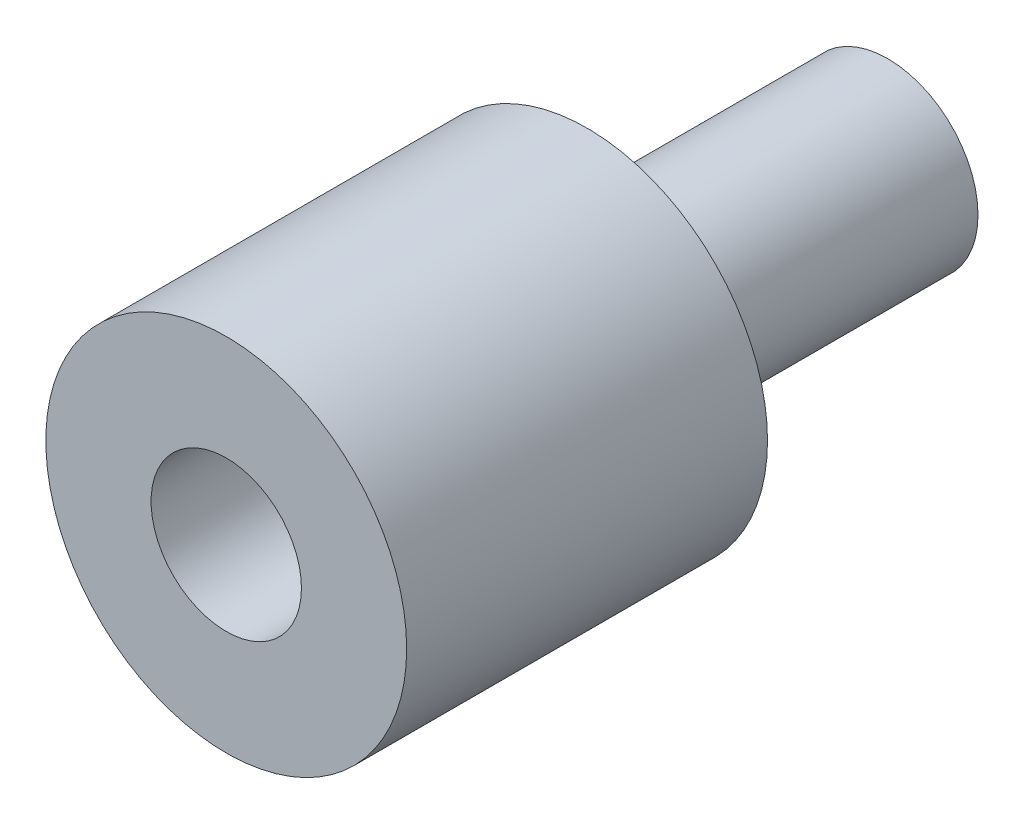
ISO-10303-21;
HEADER;
FILE_DESCRIPTION(('STEP AP214'),'2;1');
FILE_NAME('part.step','',(''),(''),'','','');
FILE_SCHEMA(('AUTOMOTIVE_DESIGN { 1 0 10303 214 1 1 1 1 }'));
ENDSEC;
DATA;
#1=APPLICATION_CONTEXT('core data for automotive mechanical design processes');
#2=APPLICATION_PROTOCOL_DEFINITION('international standard','automotive_design',2000,#1);
#3=PRODUCT_CONTEXT('',#1,'mechanical');
#4=PRODUCT('Part','Part','',(#3));
#5=PRODUCT_RELATED_PRODUCT_CATEGORY('part','',(#4));
#6=PRODUCT_DEFINITION_FORMATION('','',#4);
#7=PRODUCT_DEFINITION_CONTEXT('part definition',#1,'design');
#8=PRODUCT_DEFINITION('design','',#6,#7);
#9=PRODUCT_DEFINITION_SHAPE('','',#8);
#10=(LENGTH_UNIT() NAMED_UNIT(*) SI_UNIT(.MILLI.,.METRE.));
#11=(NAMED_UNIT(*) PLANE_ANGLE_UNIT() SI_UNIT($,.RADIAN.));
#12=(NAMED_UNIT(*) SI_UNIT($,.STERADIAN.) SOLID_ANGLE_UNIT());
#13=UNCERTAINTY_MEASURE_WITH_UNIT(LENGTH_MEASURE(1.E-05),#10,'distance_accuracy_value','');
#14=(GEOMETRIC_REPRESENTATION_CONTEXT(3) GLOBAL_UNCERTAINTY_ASSIGNED_CONTEXT((#13)) GLOBAL_UNIT_ASSIGNED_CONTEXT((#10,
#11,#12)) REPRESENTATION_CONTEXT('',''));
#15=CARTESIAN_POINT('',(0.,0.,0.));
#16=DIRECTION('',(0.,0.,1.));
#17=DIRECTION('',(1.,0.,0.));
#18=AXIS2_PLACEMENT_3D('',#15,#16,#17);
#19=CARTESIAN_POINT('',(0.,0.,24.));
#20=DIRECTION('',(0.,0.,-1.));
#21=DIRECTION('',(-1.,0.,0.));
#22=AXIS2_PLACEMENT_3D('',#19,#20,#21);
#23=CYLINDRICAL_SURFACE('',#22,12.);
#24=CARTESIAN_POINT('',(0.,0.,24.));
#25=DIRECTION('',(0.,0.,1.));
#26=DIRECTION('',(1.,0.,0.));
#27=AXIS2_PLACEMENT_3D('',#24,#25,#26);
#28=CIRCLE('',#27,12.);
#29=CARTESIAN_POINT('',(12.,0.,24.));
#30=VERTEX_POINT('',#29);
#31=EDGE_CURVE('E45',#30,#30,#28,.T.);
#32=ORIENTED_EDGE('',*,*,#31,.F.);
#33=EDGE_LOOP('',(#32));
#34=FACE_BOUND('',#33,.T.);
#35=CARTESIAN_POINT('',(0.,0.,0.));
#36=DIRECTION('',(0.,0.,1.));
#37=DIRECTION('',(1.,0.,0.));
#38=AXIS2_PLACEMENT_3D('',#35,#36,#37);
#39=CIRCLE('',#38,12.);
#40=CARTESIAN_POINT('',(12.,0.,0.));
#41=VERTEX_POINT('',#40);
#42=EDGE_CURVE('E40',#41,#41,#39,.T.);
#43=ORIENTED_EDGE('',*,*,#42,.T.);
#44=EDGE_LOOP('',(#43));
#45=FACE_BOUND('',#44,.T.);
#46=ADVANCED_FACE('F37',(#34,#45),#23,.T.);
#47=CARTESIAN_POINT('',(0.,0.,24.));
#48=DIRECTION('',(0.,0.,1.));
#49=DIRECTION('',(1.,0.,0.));
#50=AXIS2_PLACEMENT_3D('',#47,#48,#49);
#51=PLANE('',#50);
#52=CARTESIAN_POINT('',(0.,0.,24.));
#53=DIRECTION('',(0.,0.,1.));
#54=DIRECTION('',(1.,0.,0.));
#55=AXIS2_PLACEMENT_3D('',#52,#53,#54);
#56=CIRCLE('',#55,5.);
#57=CARTESIAN_POINT('',(5.,0.,24.));
#58=VERTEX_POINT('',#57);
#59=EDGE_CURVE('E58',#58,#58,#56,.T.);
#60=ORIENTED_EDGE('',*,*,#59,.F.);
#61=EDGE_LOOP('',(#60));
#62=FACE_BOUND('',#61,.T.);
#63=ORIENTED_EDGE('',*,*,#31,.T.);
#64=EDGE_LOOP('',(#63));
#65=FACE_BOUND('',#64,.T.);
#66=ADVANCED_FACE('F82',(#62,#65),#51,.T.);
#67=CARTESIAN_POINT('',(0.,0.,0.));
#68=DIRECTION('',(0.,0.,1.));
#69=DIRECTION('',(1.,0.,0.));
#70=AXIS2_PLACEMENT_3D('',#67,#68,#69);
#71=PLANE('',#70);
#72=CARTESIAN_POINT('',(0.,0.,0.));
#73=DIRECTION('',(0.,0.,-1.));
#74=DIRECTION('',(-1.,0.,0.));
#75=AXIS2_PLACEMENT_3D('',#72,#73,#74);
#76=CIRCLE('',#75,6.);
#77=CARTESIAN_POINT('',(-6.,0.,0.));
#78=VERTEX_POINT('',#77);
#79=EDGE_CURVE('E10',#78,#78,#76,.T.);
#80=ORIENTED_EDGE('',*,*,#79,.F.);
#81=EDGE_LOOP('',(#80));
#82=FACE_BOUND('',#81,.T.);
#83=ORIENTED_EDGE('',*,*,#42,.F.);
#84=EDGE_LOOP('',(#83));
#85=FACE_BOUND('',#84,.T.);
#86=ADVANCED_FACE('F87',(#82,#85),#71,.F.);
#87=CARTESIAN_POINT('',(0.,0.,12.));
#88=DIRECTION('',(0.,0.,1.));
#89=DIRECTION('',(1.,0.,0.));
#90=AXIS2_PLACEMENT_3D('',#87,#88,#89);
#91=CYLINDRICAL_SURFACE('',#90,5.);
#92=CARTESIAN_POINT('',(0.,0.,12.));
#93=DIRECTION('',(0.,0.,1.));
#94=DIRECTION('',(1.,0.,0.));
#95=AXIS2_PLACEMENT_3D('',#92,#93,#94);
#96=CIRCLE('',#95,5.);
#97=CARTESIAN_POINT('',(5.,0.,12.));
#98=VERTEX_POINT('',#97);
#99=EDGE_CURVE('E54',#98,#98,#96,.T.);
#100=ORIENTED_EDGE('',*,*,#99,.F.);
#101=EDGE_LOOP('',(#100));
#102=FACE_BOUND('',#101,.T.);
#103=ORIENTED_EDGE('',*,*,#59,.T.);
#104=EDGE_LOOP('',(#103));
#105=FACE_BOUND('',#104,.T.);
#106=ADVANCED_FACE('F78',(#102,#105),#91,.F.);
#107=CARTESIAN_POINT('',(0.,0.,12.));
#108=DIRECTION('',(0.,0.,1.));
#109=DIRECTION('',(1.,0.,0.));
#110=AXIS2_PLACEMENT_3D('',#107,#108,#109);
#111=PLANE('',#110);
#112=ORIENTED_EDGE('',*,*,#99,.T.);
#113=EDGE_LOOP('',(#112));
#114=FACE_BOUND('',#113,.T.);
#115=ADVANCED_FACE('F71',(#114),#111,.T.);
#116=CARTESIAN_POINT('',(0.,0.,-20.));
#117=DIRECTION('',(0.,0.,1.));
#118=DIRECTION('',(1.,0.,0.));
#119=AXIS2_PLACEMENT_3D('',#116,#117,#118);
#120=CYLINDRICAL_SURFACE('',#119,6.);
#121=CARTESIAN_POINT('',(0.,0.,-20.));
#122=DIRECTION('',(0.,0.,-1.));
#123=DIRECTION('',(-1.,0.,0.));
#124=AXIS2_PLACEMENT_3D('',#121,#122,#123);
#125=CIRCLE('',#124,6.);
#126=CARTESIAN_POINT('',(-6.,0.,-20.));
#127=VERTEX_POINT('',#126);
#128=EDGE_CURVE('E53',#127,#127,#125,.T.);
#129=ORIENTED_EDGE('',*,*,#128,.F.);
#130=EDGE_LOOP('',(#129));
#131=FACE_BOUND('',#130,.T.);
#132=ORIENTED_EDGE('',*,*,#79,.T.);
#133=EDGE_LOOP('',(#132));
#134=FACE_BOUND('',#133,.T.);
#135=ADVANCED_FACE('F69',(#131,#134),#120,.T.);
#136=CARTESIAN_POINT('',(0.,0.,-20.));
#137=DIRECTION('',(0.,0.,-1.));
#138=DIRECTION('',(-1.,0.,0.));
#139=AXIS2_PLACEMENT_3D('',#136,#137,#138);
#140=PLANE('',#139);
#141=ORIENTED_EDGE('',*,*,#128,.T.);
#142=EDGE_LOOP('',(#141));
#143=FACE_BOUND('',#142,.T.);
#144=ADVANCED_FACE('F67',(#143),#140,.T.);
#145=CLOSED_SHELL('',(#46,#66,#86,#106,#115,#135,#144));
#146=MANIFOLD_SOLID_BREP('B2',#145);
#147=ADVANCED_BREP_SHAPE_REPRESENTATION('',(#18,#146),#14);
#148=SHAPE_DEFINITION_REPRESENTATION(#9,#147);
ENDSEC;
END-ISO-10303-21;
